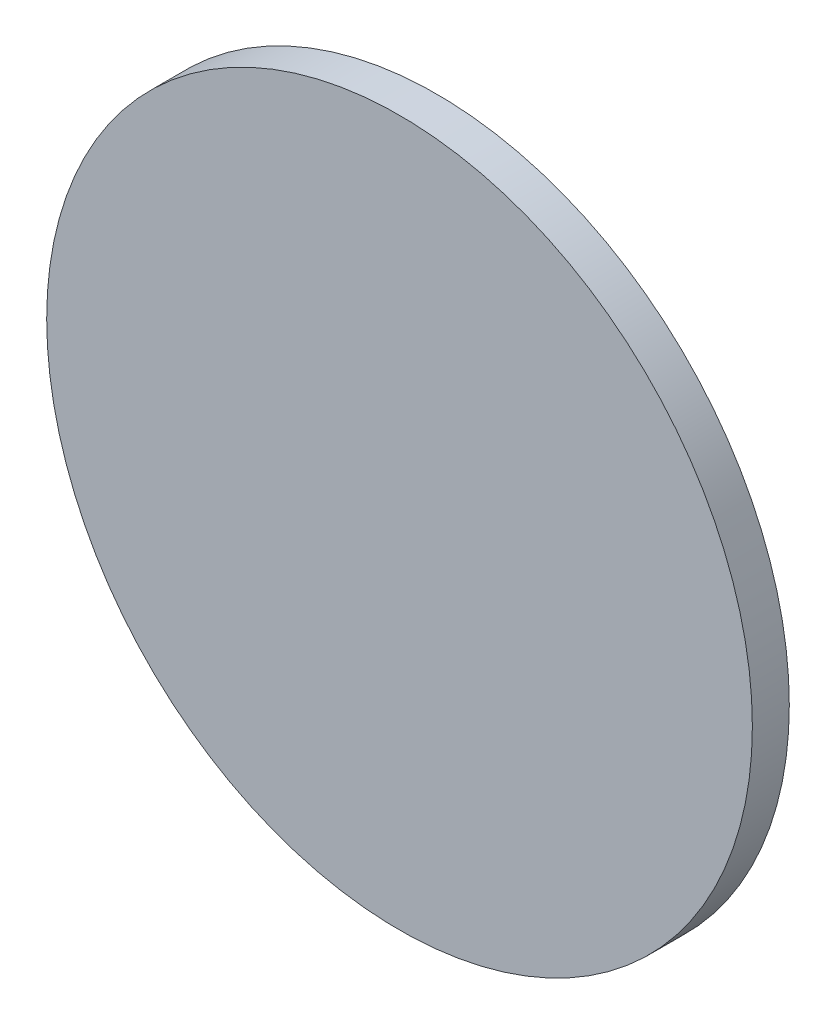
ISO-10303-21;
HEADER;
FILE_DESCRIPTION(('STEP AP214'),'2;1');
FILE_NAME('part.step','',(''),(''),'','','');
FILE_SCHEMA(('AUTOMOTIVE_DESIGN { 1 0 10303 214 1 1 1 1 }'));
ENDSEC;
DATA;
#1=APPLICATION_CONTEXT('core data for automotive mechanical design processes');
#2=APPLICATION_PROTOCOL_DEFINITION('international standard','automotive_design',2000,#1);
#3=PRODUCT_CONTEXT('',#1,'mechanical');
#4=PRODUCT('Part','Part','',(#3));
#5=PRODUCT_RELATED_PRODUCT_CATEGORY('part','',(#4));
#6=PRODUCT_DEFINITION_FORMATION('','',#4);
#7=PRODUCT_DEFINITION_CONTEXT('part definition',#1,'design');
#8=PRODUCT_DEFINITION('design','',#6,#7);
#9=PRODUCT_DEFINITION_SHAPE('','',#8);
#10=(LENGTH_UNIT() NAMED_UNIT(*) SI_UNIT(.MILLI.,.METRE.));
#11=(NAMED_UNIT(*) PLANE_ANGLE_UNIT() SI_UNIT($,.RADIAN.));
#12=(NAMED_UNIT(*) SI_UNIT($,.STERADIAN.) SOLID_ANGLE_UNIT());
#13=UNCERTAINTY_MEASURE_WITH_UNIT(LENGTH_MEASURE(1.E-05),#10,'distance_accuracy_value','');
#14=(GEOMETRIC_REPRESENTATION_CONTEXT(3) GLOBAL_UNCERTAINTY_ASSIGNED_CONTEXT((#13)) GLOBAL_UNIT_ASSIGNED_CONTEXT((#10,
#11,#12)) REPRESENTATION_CONTEXT('',''));
#15=CARTESIAN_POINT('',(0.,0.,0.));
#16=DIRECTION('',(0.,0.,1.));
#17=DIRECTION('',(1.,0.,0.));
#18=AXIS2_PLACEMENT_3D('',#15,#16,#17);
#19=CARTESIAN_POINT('',(0.,0.,5.));
#20=DIRECTION('',(0.,0.,-1.));
#21=DIRECTION('',(-1.,0.,0.));
#22=AXIS2_PLACEMENT_3D('',#19,#20,#21);
#23=CYLINDRICAL_SURFACE('',#22,47.75);
#24=CARTESIAN_POINT('',(0.,0.,5.));
#25=DIRECTION('',(0.,0.,1.));
#26=DIRECTION('',(1.,0.,0.));
#27=AXIS2_PLACEMENT_3D('',#24,#25,#26);
#28=CIRCLE('',#27,47.75);
#29=CARTESIAN_POINT('',(47.75,0.,5.));
#30=VERTEX_POINT('',#29);
#31=EDGE_CURVE('E10',#30,#30,#28,.T.);
#32=ORIENTED_EDGE('',*,*,#31,.F.);
#33=EDGE_LOOP('',(#32));
#34=FACE_BOUND('',#33,.T.);
#35=CARTESIAN_POINT('',(0.,0.,0.));
#36=DIRECTION('',(0.,0.,1.));
#37=DIRECTION('',(1.,0.,0.));
#38=AXIS2_PLACEMENT_3D('',#35,#36,#37);
#39=CIRCLE('',#38,47.75);
#40=CARTESIAN_POINT('',(47.75,0.,0.));
#41=VERTEX_POINT('',#40);
#42=EDGE_CURVE('E34',#41,#41,#39,.T.);
#43=ORIENTED_EDGE('',*,*,#42,.T.);
#44=EDGE_LOOP('',(#43));
#45=FACE_BOUND('',#44,.T.);
#46=ADVANCED_FACE('F31',(#34,#45),#23,.T.);
#47=CARTESIAN_POINT('',(0.,0.,5.));
#48=DIRECTION('',(0.,0.,1.));
#49=DIRECTION('',(1.,0.,0.));
#50=AXIS2_PLACEMENT_3D('',#47,#48,#49);
#51=PLANE('',#50);
#52=ORIENTED_EDGE('',*,*,#31,.T.);
#53=EDGE_LOOP('',(#52));
#54=FACE_BOUND('',#53,.T.);
#55=ADVANCED_FACE('F46',(#54),#51,.T.);
#56=CARTESIAN_POINT('',(0.,0.,0.));
#57=DIRECTION('',(0.,0.,1.));
#58=DIRECTION('',(1.,0.,0.));
#59=AXIS2_PLACEMENT_3D('',#56,#57,#58);
#60=PLANE('',#59);
#61=ORIENTED_EDGE('',*,*,#42,.F.);
#62=EDGE_LOOP('',(#61));
#63=FACE_BOUND('',#62,.T.);
#64=ADVANCED_FACE('F44',(#63),#60,.F.);
#65=CLOSED_SHELL('',(#46,#55,#64));
#66=MANIFOLD_SOLID_BREP('B2',#65);
#67=ADVANCED_BREP_SHAPE_REPRESENTATION('',(#18,#66),#14);
#68=SHAPE_DEFINITION_REPRESENTATION(#9,#67);
ENDSEC;
END-ISO-10303-21;
